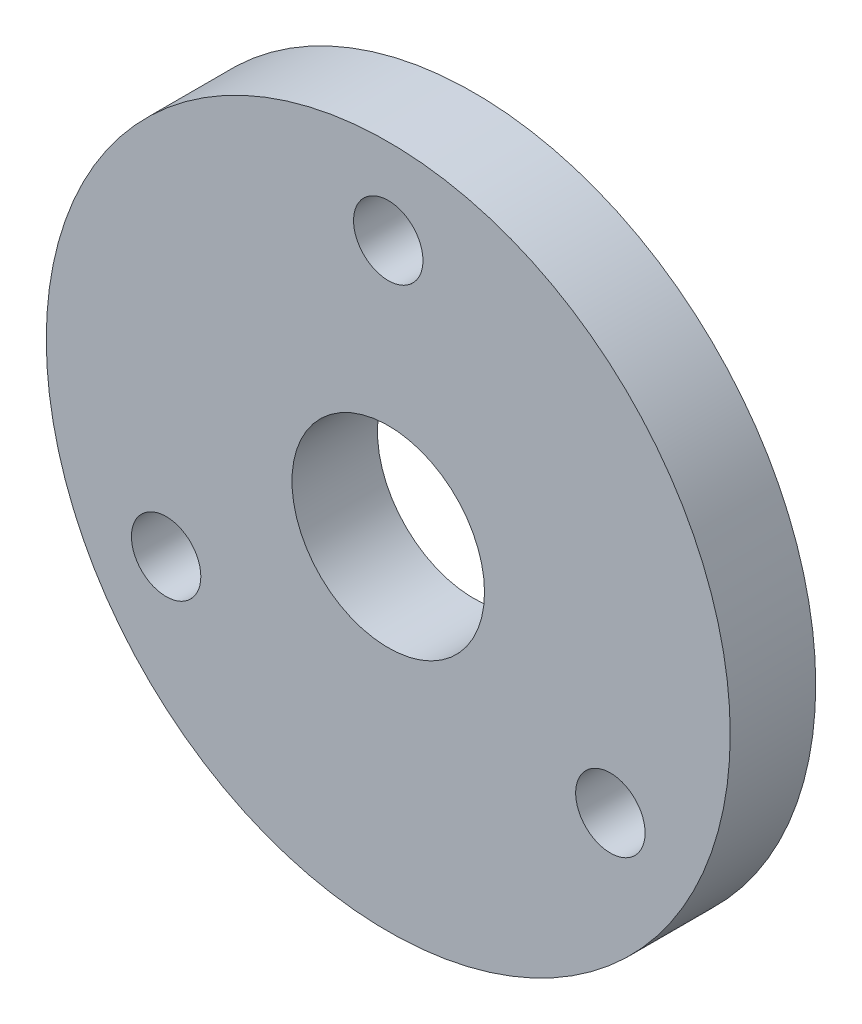
ISO-10303-21;
HEADER;
FILE_DESCRIPTION(('STEP AP214'),'2;1');
FILE_NAME('part.step','',(''),(''),'','','');
FILE_SCHEMA(('AUTOMOTIVE_DESIGN { 1 0 10303 214 1 1 1 1 }'));
ENDSEC;
DATA;
#1=APPLICATION_CONTEXT('core data for automotive mechanical design processes');
#2=APPLICATION_PROTOCOL_DEFINITION('international standard','automotive_design',2000,#1);
#3=PRODUCT_CONTEXT('',#1,'mechanical');
#4=PRODUCT('Part','Part','',(#3));
#5=PRODUCT_RELATED_PRODUCT_CATEGORY('part','',(#4));
#6=PRODUCT_DEFINITION_FORMATION('','',#4);
#7=PRODUCT_DEFINITION_CONTEXT('part definition',#1,'design');
#8=PRODUCT_DEFINITION('design','',#6,#7);
#9=PRODUCT_DEFINITION_SHAPE('','',#8);
#10=(LENGTH_UNIT() NAMED_UNIT(*) SI_UNIT(.MILLI.,.METRE.));
#11=(NAMED_UNIT(*) PLANE_ANGLE_UNIT() SI_UNIT($,.RADIAN.));
#12=(NAMED_UNIT(*) SI_UNIT($,.STERADIAN.) SOLID_ANGLE_UNIT());
#13=UNCERTAINTY_MEASURE_WITH_UNIT(LENGTH_MEASURE(1.E-05),#10,'distance_accuracy_value','');
#14=(GEOMETRIC_REPRESENTATION_CONTEXT(3) GLOBAL_UNCERTAINTY_ASSIGNED_CONTEXT((#13)) GLOBAL_UNIT_ASSIGNED_CONTEXT((#10,
#11,#12)) REPRESENTATION_CONTEXT('',''));
#15=CARTESIAN_POINT('',(0.,0.,0.));
#16=DIRECTION('',(0.,0.,1.));
#17=DIRECTION('',(1.,0.,0.));
#18=AXIS2_PLACEMENT_3D('',#15,#16,#17);
#19=CARTESIAN_POINT('',(0.,0.,6.35000000000004));
#20=DIRECTION('',(0.,0.,1.));
#21=DIRECTION('',(1.,0.,0.));
#22=AXIS2_PLACEMENT_3D('',#19,#20,#21);
#23=PLANE('',#22);
#24=CARTESIAN_POINT('',(16.4977839420957,-9.52499999999872,6.35000000000004));
#25=DIRECTION('',(0.,0.,1.));
#26=DIRECTION('',(1.,0.,0.));
#27=AXIS2_PLACEMENT_3D('',#24,#25,#26);
#28=CIRCLE('',#27,2.57810000000168);
#29=CARTESIAN_POINT('',(19.0758839420973,-9.52499999999871,6.35000000000005));
#30=VERTEX_POINT('',#29);
#31=EDGE_CURVE('E69',#30,#30,#28,.T.);
#32=ORIENTED_EDGE('',*,*,#31,.F.);
#33=EDGE_LOOP('',(#32));
#34=FACE_BOUND('',#33,.T.);
#35=CARTESIAN_POINT('',(0.,19.0499999999998,6.34999999999998));
#36=DIRECTION('',(0.,0.,1.));
#37=DIRECTION('',(1.,0.,0.));
#38=AXIS2_PLACEMENT_3D('',#35,#36,#37);
#39=CIRCLE('',#38,2.5781);
#40=CARTESIAN_POINT('',(2.57810000000009,19.0499999999998,6.34999999999999));
#41=VERTEX_POINT('',#40);
#42=EDGE_CURVE('E55',#41,#41,#39,.T.);
#43=ORIENTED_EDGE('',*,*,#42,.F.);
#44=EDGE_LOOP('',(#43));
#45=FACE_BOUND('',#44,.T.);
#46=CARTESIAN_POINT('',(0.,0.,6.35000000000004));
#47=DIRECTION('',(0.,0.,1.));
#48=DIRECTION('',(1.,0.,0.));
#49=AXIS2_PLACEMENT_3D('',#46,#47,#48);
#50=CIRCLE('',#49,25.4);
#51=CARTESIAN_POINT('',(25.4000000000001,0.,6.35000000000014));
#52=VERTEX_POINT('',#51);
#53=EDGE_CURVE('E12',#52,#52,#50,.T.);
#54=ORIENTED_EDGE('',*,*,#53,.T.);
#55=EDGE_LOOP('',(#54));
#56=FACE_BOUND('',#55,.T.);
#57=CARTESIAN_POINT('',(-16.4977839420915,-9.52500000000114,6.35000000000001));
#58=DIRECTION('',(0.,0.,1.));
#59=DIRECTION('',(1.,0.,0.));
#60=AXIS2_PLACEMENT_3D('',#57,#58,#59);
#61=CIRCLE('',#60,2.57810000000245);
#62=CARTESIAN_POINT('',(-13.919683942089,-9.52500000000113,6.35000000000002));
#63=VERTEX_POINT('',#62);
#64=EDGE_CURVE('E63',#63,#63,#61,.T.);
#65=ORIENTED_EDGE('',*,*,#64,.F.);
#66=EDGE_LOOP('',(#65));
#67=FACE_BOUND('',#66,.T.);
#68=CARTESIAN_POINT('',(0.,0.,6.35000000000004));
#69=DIRECTION('',(0.,0.,1.));
#70=DIRECTION('',(1.,0.,0.));
#71=AXIS2_PLACEMENT_3D('',#68,#69,#70);
#72=CIRCLE('',#71,7.1501);
#73=CARTESIAN_POINT('',(7.15010000000009,0.,6.35000000000007));
#74=VERTEX_POINT('',#73);
#75=EDGE_CURVE('E72',#74,#74,#72,.T.);
#76=ORIENTED_EDGE('',*,*,#75,.F.);
#77=EDGE_LOOP('',(#76));
#78=FACE_BOUND('',#77,.T.);
#79=ADVANCED_FACE('F44',(#34,#45,#56,#67,#78),#23,.T.);
#80=CARTESIAN_POINT('',(0.,0.,0.));
#81=DIRECTION('',(0.,0.,1.));
#82=DIRECTION('',(1.,0.,0.));
#83=AXIS2_PLACEMENT_3D('',#80,#81,#82);
#84=PLANE('',#83);
#85=CARTESIAN_POINT('',(16.4977839420957,-9.52499999999872,0.));
#86=DIRECTION('',(0.,0.,1.));
#87=DIRECTION('',(1.,0.,0.));
#88=AXIS2_PLACEMENT_3D('',#85,#86,#87);
#89=CIRCLE('',#88,2.57810000000168);
#90=CARTESIAN_POINT('',(19.0758839420974,-9.52499999999871,0.));
#91=VERTEX_POINT('',#90);
#92=EDGE_CURVE('E66',#91,#91,#89,.T.);
#93=ORIENTED_EDGE('',*,*,#92,.T.);
#94=EDGE_LOOP('',(#93));
#95=FACE_BOUND('',#94,.T.);
#96=CARTESIAN_POINT('',(0.,19.0499999999996,1.11022302462516E-13));
#97=DIRECTION('',(0.,0.,1.));
#98=DIRECTION('',(1.,0.,0.));
#99=AXIS2_PLACEMENT_3D('',#96,#97,#98);
#100=CIRCLE('',#99,2.5781);
#101=CARTESIAN_POINT('',(2.5781000000001,19.0499999999996,1.22022852938247E-13));
#102=VERTEX_POINT('',#101);
#103=EDGE_CURVE('E57',#102,#102,#100,.T.);
#104=ORIENTED_EDGE('',*,*,#103,.T.);
#105=EDGE_LOOP('',(#104));
#106=FACE_BOUND('',#105,.T.);
#107=CARTESIAN_POINT('',(0.,0.,0.));
#108=DIRECTION('',(0.,0.,1.));
#109=DIRECTION('',(1.,0.,0.));
#110=AXIS2_PLACEMENT_3D('',#107,#108,#109);
#111=CIRCLE('',#110,25.4);
#112=CARTESIAN_POINT('',(25.4,0.,1.08379807642674E-13));
#113=VERTEX_POINT('',#112);
#114=EDGE_CURVE('E48',#113,#113,#111,.T.);
#115=ORIENTED_EDGE('',*,*,#114,.F.);
#116=EDGE_LOOP('',(#115));
#117=FACE_BOUND('',#116,.T.);
#118=CARTESIAN_POINT('',(-16.4977839420915,-9.52500000000116,0.));
#119=DIRECTION('',(0.,0.,1.));
#120=DIRECTION('',(1.,0.,0.));
#121=AXIS2_PLACEMENT_3D('',#118,#119,#120);
#122=CIRCLE('',#121,2.57810000000245);
#123=CARTESIAN_POINT('',(-13.9196839420891,-9.52500000000116,0.));
#124=VERTEX_POINT('',#123);
#125=EDGE_CURVE('E60',#124,#124,#122,.T.);
#126=ORIENTED_EDGE('',*,*,#125,.T.);
#127=EDGE_LOOP('',(#126));
#128=FACE_BOUND('',#127,.T.);
#129=CARTESIAN_POINT('',(0.,0.,0.));
#130=DIRECTION('',(0.,0.,1.));
#131=DIRECTION('',(1.,0.,0.));
#132=AXIS2_PLACEMENT_3D('',#129,#130,#131);
#133=CIRCLE('',#132,7.1501);
#134=CARTESIAN_POINT('',(7.1501,0.,0.));
#135=VERTEX_POINT('',#134);
#136=EDGE_CURVE('E75',#135,#135,#133,.T.);
#137=ORIENTED_EDGE('',*,*,#136,.T.);
#138=EDGE_LOOP('',(#137));
#139=FACE_BOUND('',#138,.T.);
#140=ADVANCED_FACE('F85',(#95,#106,#117,#128,#139),#84,.F.);
#141=CARTESIAN_POINT('',(0.,0.,6.35000000000004));
#142=DIRECTION('',(0.,0.,-1.));
#143=DIRECTION('',(-1.,0.,0.));
#144=AXIS2_PLACEMENT_3D('',#141,#142,#143);
#145=CYLINDRICAL_SURFACE('',#144,25.4);
#146=ORIENTED_EDGE('',*,*,#53,.F.);
#147=EDGE_LOOP('',(#146));
#148=FACE_BOUND('',#147,.T.);
#149=ORIENTED_EDGE('',*,*,#114,.T.);
#150=EDGE_LOOP('',(#149));
#151=FACE_BOUND('',#150,.T.);
#152=ADVANCED_FACE('F46',(#148,#151),#145,.T.);
#153=CARTESIAN_POINT('',(0.,19.0499999999998,6.34999999999998));
#154=DIRECTION('',(0.,0.,-1.));
#155=DIRECTION('',(-1.,0.,0.));
#156=AXIS2_PLACEMENT_3D('',#153,#154,#155);
#157=CYLINDRICAL_SURFACE('',#156,2.5781);
#158=ORIENTED_EDGE('',*,*,#42,.T.);
#159=EDGE_LOOP('',(#158));
#160=FACE_BOUND('',#159,.T.);
#161=ORIENTED_EDGE('',*,*,#103,.F.);
#162=EDGE_LOOP('',(#161));
#163=FACE_BOUND('',#162,.T.);
#164=ADVANCED_FACE('F95',(#160,#163),#157,.F.);
#165=CARTESIAN_POINT('',(-16.4977839420915,-9.52500000000114,6.35000000000001));
#166=DIRECTION('',(0.,0.,-1.));
#167=DIRECTION('',(-1.,0.,0.));
#168=AXIS2_PLACEMENT_3D('',#165,#166,#167);
#169=CYLINDRICAL_SURFACE('',#168,2.57810000000245);
#170=ORIENTED_EDGE('',*,*,#64,.T.);
#171=EDGE_LOOP('',(#170));
#172=FACE_BOUND('',#171,.T.);
#173=ORIENTED_EDGE('',*,*,#125,.F.);
#174=EDGE_LOOP('',(#173));
#175=FACE_BOUND('',#174,.T.);
#176=ADVANCED_FACE('F98',(#172,#175),#169,.F.);
#177=CARTESIAN_POINT('',(16.4977839420957,-9.52499999999872,6.35000000000004));
#178=DIRECTION('',(0.,0.,-1.));
#179=DIRECTION('',(-1.,0.,0.));
#180=AXIS2_PLACEMENT_3D('',#177,#178,#179);
#181=CYLINDRICAL_SURFACE('',#180,2.57810000000168);
#182=ORIENTED_EDGE('',*,*,#31,.T.);
#183=EDGE_LOOP('',(#182));
#184=FACE_BOUND('',#183,.T.);
#185=ORIENTED_EDGE('',*,*,#92,.F.);
#186=EDGE_LOOP('',(#185));
#187=FACE_BOUND('',#186,.T.);
#188=ADVANCED_FACE('F102',(#184,#187),#181,.F.);
#189=CARTESIAN_POINT('',(0.,0.,6.35000000000004));
#190=DIRECTION('',(0.,0.,-1.));
#191=DIRECTION('',(-1.,0.,0.));
#192=AXIS2_PLACEMENT_3D('',#189,#190,#191);
#193=CYLINDRICAL_SURFACE('',#192,7.1501);
#194=ORIENTED_EDGE('',*,*,#75,.T.);
#195=EDGE_LOOP('',(#194));
#196=FACE_BOUND('',#195,.T.);
#197=ORIENTED_EDGE('',*,*,#136,.F.);
#198=EDGE_LOOP('',(#197));
#199=FACE_BOUND('',#198,.T.);
#200=ADVANCED_FACE('F81',(#196,#199),#193,.F.);
#201=CLOSED_SHELL('',(#79,#140,#152,#164,#176,#188,#200));
#202=MANIFOLD_SOLID_BREP('B2',#201);
#203=ADVANCED_BREP_SHAPE_REPRESENTATION('',(#18,#202),#14);
#204=SHAPE_DEFINITION_REPRESENTATION(#9,#203);
ENDSEC;
END-ISO-10303-21;
